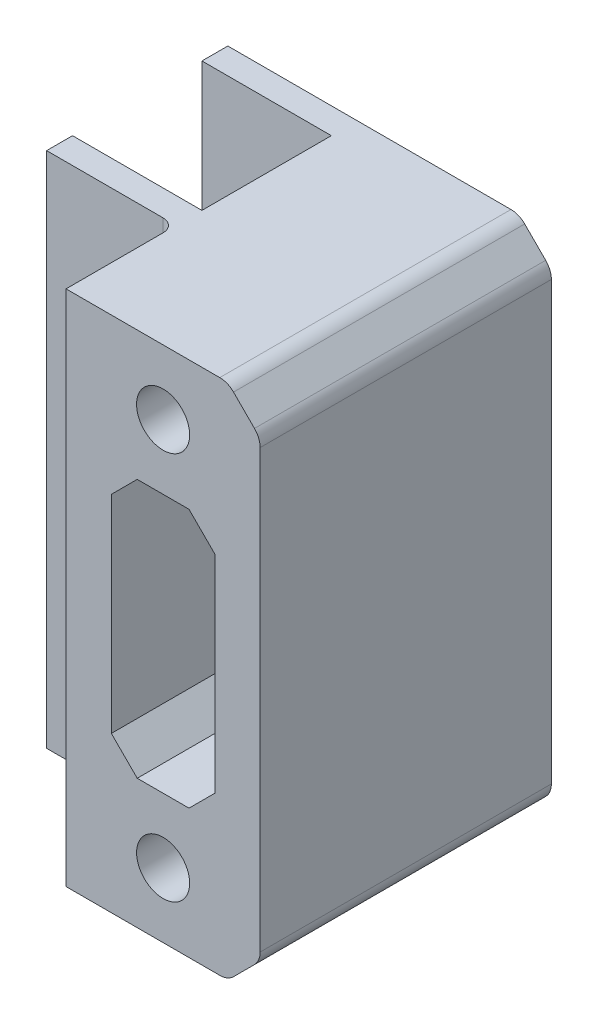
ISO-10303-21;
HEADER;
FILE_DESCRIPTION(('STEP AP214'),'2;1');
FILE_NAME('part.step','',(''),(''),'','','');
FILE_SCHEMA(('AUTOMOTIVE_DESIGN { 1 0 10303 214 1 1 1 1 }'));
ENDSEC;
DATA;
#1=APPLICATION_CONTEXT('core data for automotive mechanical design processes');
#2=APPLICATION_PROTOCOL_DEFINITION('international standard','automotive_design',2000,#1);
#3=PRODUCT_CONTEXT('',#1,'mechanical');
#4=PRODUCT('Part','Part','',(#3));
#5=PRODUCT_RELATED_PRODUCT_CATEGORY('part','',(#4));
#6=PRODUCT_DEFINITION_FORMATION('','',#4);
#7=PRODUCT_DEFINITION_CONTEXT('part definition',#1,'design');
#8=PRODUCT_DEFINITION('design','',#6,#7);
#9=PRODUCT_DEFINITION_SHAPE('','',#8);
#10=(LENGTH_UNIT() NAMED_UNIT(*) SI_UNIT(.MILLI.,.METRE.));
#11=(NAMED_UNIT(*) PLANE_ANGLE_UNIT() SI_UNIT($,.RADIAN.));
#12=(NAMED_UNIT(*) SI_UNIT($,.STERADIAN.) SOLID_ANGLE_UNIT());
#13=UNCERTAINTY_MEASURE_WITH_UNIT(LENGTH_MEASURE(1.E-05),#10,'distance_accuracy_value','');
#14=(GEOMETRIC_REPRESENTATION_CONTEXT(3) GLOBAL_UNCERTAINTY_ASSIGNED_CONTEXT((#13)) GLOBAL_UNIT_ASSIGNED_CONTEXT((#10,
#11,#12)) REPRESENTATION_CONTEXT('',''));
#15=CARTESIAN_POINT('',(0.,0.,0.));
#16=DIRECTION('',(0.,0.,1.));
#17=DIRECTION('',(1.,0.,0.));
#18=AXIS2_PLACEMENT_3D('',#15,#16,#17);
#19=CARTESIAN_POINT('',(0.,29.9999999999997,22.5));
#20=DIRECTION('',(0.,0.,-1.));
#21=DIRECTION('',(-1.,0.,0.));
#22=AXIS2_PLACEMENT_3D('',#19,#20,#21);
#23=CYLINDRICAL_SURFACE('',#22,4.10000000000005);
#24=CARTESIAN_POINT('',(0.,29.9999999999997,22.5));
#25=DIRECTION('',(0.,0.,1.));
#26=DIRECTION('',(1.,0.,0.));
#27=AXIS2_PLACEMENT_3D('',#24,#25,#26);
#28=CIRCLE('',#27,4.10000000000005);
#29=CARTESIAN_POINT('',(-4.10000000000005,29.9999999999997,22.5));
#30=VERTEX_POINT('',#29);
#31=EDGE_CURVE('E282',#30,#30,#28,.T.);
#32=CARTESIAN_POINT('',(0.,29.9999999999997,2.5));
#33=DIRECTION('',(0.,0.,-1.));
#34=DIRECTION('',(-1.,0.,0.));
#35=AXIS2_PLACEMENT_3D('',#32,#33,#34);
#36=CIRCLE('',#35,4.10000000000005);
#37=CARTESIAN_POINT('',(-4.10000000000005,29.9999999999997,2.50000000000001));
#38=VERTEX_POINT('',#37);
#39=EDGE_CURVE('E246',#38,#38,#36,.T.);
#40=CARTESIAN_POINT('',(-4.10000000000005,29.9999999999997,22.5));
#41=CARTESIAN_POINT('',(-4.10000000000005,29.9999999999997,22.2916666666667));
#42=CARTESIAN_POINT('',(-4.10000000000005,29.9999999999997,22.0833333333333));
#43=CARTESIAN_POINT('',(-4.10000000000005,29.9999999999997,21.6666666666667));
#44=CARTESIAN_POINT('',(-4.10000000000005,29.9999999999997,21.4583333333333));
#45=CARTESIAN_POINT('',(-4.10000000000005,29.9999999999997,21.0416666666667));
#46=CARTESIAN_POINT('',(-4.10000000000005,29.9999999999997,20.8333333333333));
#47=CARTESIAN_POINT('',(-4.10000000000005,29.9999999999997,20.4166666666667));
#48=CARTESIAN_POINT('',(-4.10000000000005,29.9999999999997,20.2083333333333));
#49=CARTESIAN_POINT('',(-4.10000000000005,29.9999999999997,19.7916666666667));
#50=CARTESIAN_POINT('',(-4.10000000000005,29.9999999999997,19.5833333333333));
#51=CARTESIAN_POINT('',(-4.10000000000005,29.9999999999997,19.1666666666667));
#52=CARTESIAN_POINT('',(-4.10000000000005,29.9999999999997,18.9583333333333));
#53=CARTESIAN_POINT('',(-4.10000000000005,29.9999999999997,18.5416666666667));
#54=CARTESIAN_POINT('',(-4.10000000000005,29.9999999999997,18.3333333333333));
#55=CARTESIAN_POINT('',(-4.10000000000005,29.9999999999997,17.9166666666667));
#56=CARTESIAN_POINT('',(-4.10000000000005,29.9999999999997,17.7083333333333));
#57=CARTESIAN_POINT('',(-4.10000000000005,29.9999999999997,17.2916666666667));
#58=CARTESIAN_POINT('',(-4.10000000000005,29.9999999999997,17.0833333333333));
#59=CARTESIAN_POINT('',(-4.10000000000005,29.9999999999997,16.6666666666667));
#60=CARTESIAN_POINT('',(-4.10000000000005,29.9999999999997,16.4583333333333));
#61=CARTESIAN_POINT('',(-4.10000000000005,29.9999999999997,16.0416666666667));
#62=CARTESIAN_POINT('',(-4.10000000000005,29.9999999999997,15.8333333333333));
#63=CARTESIAN_POINT('',(-4.10000000000005,29.9999999999997,15.4166666666667));
#64=CARTESIAN_POINT('',(-4.10000000000005,29.9999999999997,15.2083333333333));
#65=CARTESIAN_POINT('',(-4.10000000000005,29.9999999999997,14.7916666666667));
#66=CARTESIAN_POINT('',(-4.10000000000005,29.9999999999997,14.5833333333333));
#67=CARTESIAN_POINT('',(-4.10000000000005,29.9999999999997,14.1666666666667));
#68=CARTESIAN_POINT('',(-4.10000000000005,29.9999999999997,13.9583333333333));
#69=CARTESIAN_POINT('',(-4.10000000000005,29.9999999999997,13.5416666666667));
#70=CARTESIAN_POINT('',(-4.10000000000005,29.9999999999997,13.3333333333333));
#71=CARTESIAN_POINT('',(-4.10000000000005,29.9999999999997,12.9166666666667));
#72=CARTESIAN_POINT('',(-4.10000000000005,29.9999999999997,12.7083333333333));
#73=CARTESIAN_POINT('',(-4.10000000000005,29.9999999999997,12.2916666666667));
#74=CARTESIAN_POINT('',(-4.10000000000005,29.9999999999997,12.0833333333333));
#75=CARTESIAN_POINT('',(-4.10000000000005,29.9999999999997,11.6666666666667));
#76=CARTESIAN_POINT('',(-4.10000000000005,29.9999999999997,11.4583333333333));
#77=CARTESIAN_POINT('',(-4.10000000000005,29.9999999999997,11.0416666666667));
#78=CARTESIAN_POINT('',(-4.10000000000005,29.9999999999997,10.8333333333333));
#79=CARTESIAN_POINT('',(-4.10000000000005,29.9999999999997,10.4166666666667));
#80=CARTESIAN_POINT('',(-4.10000000000005,29.9999999999997,10.2083333333333));
#81=CARTESIAN_POINT('',(-4.10000000000005,29.9999999999997,9.79166666666667));
#82=CARTESIAN_POINT('',(-4.10000000000005,29.9999999999997,9.58333333333333));
#83=CARTESIAN_POINT('',(-4.10000000000005,29.9999999999997,9.16666666666667));
#84=CARTESIAN_POINT('',(-4.10000000000005,29.9999999999997,8.95833333333333));
#85=CARTESIAN_POINT('',(-4.10000000000005,29.9999999999997,8.54166666666667));
#86=CARTESIAN_POINT('',(-4.10000000000005,29.9999999999997,8.33333333333334));
#87=CARTESIAN_POINT('',(-4.10000000000005,29.9999999999997,7.91666666666667));
#88=CARTESIAN_POINT('',(-4.10000000000005,29.9999999999997,7.70833333333334));
#89=CARTESIAN_POINT('',(-4.10000000000005,29.9999999999997,7.29166666666667));
#90=CARTESIAN_POINT('',(-4.10000000000005,29.9999999999997,7.08333333333333));
#91=CARTESIAN_POINT('',(-4.10000000000005,29.9999999999997,6.66666666666667));
#92=CARTESIAN_POINT('',(-4.10000000000005,29.9999999999997,6.45833333333334));
#93=CARTESIAN_POINT('',(-4.10000000000005,29.9999999999997,6.04166666666667));
#94=CARTESIAN_POINT('',(-4.10000000000005,29.9999999999997,5.83333333333334));
#95=CARTESIAN_POINT('',(-4.10000000000005,29.9999999999997,5.41666666666667));
#96=CARTESIAN_POINT('',(-4.10000000000005,29.9999999999997,5.20833333333334));
#97=CARTESIAN_POINT('',(-4.10000000000005,29.9999999999997,4.79166666666667));
#98=CARTESIAN_POINT('',(-4.10000000000005,29.9999999999997,4.58333333333334));
#99=CARTESIAN_POINT('',(-4.10000000000005,29.9999999999997,4.16666666666667));
#100=CARTESIAN_POINT('',(-4.10000000000005,29.9999999999997,3.95833333333334));
#101=CARTESIAN_POINT('',(-4.10000000000005,29.9999999999997,3.54166666666667));
#102=CARTESIAN_POINT('',(-4.10000000000005,29.9999999999997,3.33333333333334));
#103=CARTESIAN_POINT('',(-4.10000000000005,29.9999999999997,2.91666666666667));
#104=CARTESIAN_POINT('',(-4.10000000000005,29.9999999999997,2.70833333333334));
#105=CARTESIAN_POINT('',(-4.10000000000005,29.9999999999997,2.50000000000001));
#106=B_SPLINE_CURVE_WITH_KNOTS('',3,(#40,#41,#42,#43,#44,#45,#46,#47,#48,#49,#50,#51,#52,#53,
#54,#55,#56,#57,#58,#59,#60,#61,#62,#63,#64,#65,#66,#67,#68,#69,#70,#71,#72,#73,#74,#75,#76,#77,
#78,#79,#80,#81,#82,#83,#84,#85,#86,#87,#88,#89,#90,#91,#92,#93,#94,#95,#96,#97,#98,#99,#100,
#101,#102,#103,#104,#105),.UNSPECIFIED.,.F.,.F.,(4,2,2,2,2,2,2,2,2,2,2,2,2,2,2,2,2,2,2,2,2,2,2,
2,2,2,2,2,2,2,2,2,4),(0.,0.625000000000001,1.25,1.875,2.5,3.125,3.75,4.375,5.,5.625,6.25,6.875,
7.5,8.125,8.75,9.375,10.,10.625,11.25,11.875,12.5,13.125,13.75,14.375,15.,15.625,16.25,16.875,
17.5,18.125,18.75,19.375,20.),.UNSPECIFIED.);
#107=EDGE_CURVE('BSEAM44',#30,#38,#106,.T.);
#108=ORIENTED_EDGE('',*,*,#31,.T.);
#109=ORIENTED_EDGE('',*,*,#39,.T.);
#110=ORIENTED_EDGE('',*,*,#107,.T.);
#111=ORIENTED_EDGE('',*,*,#107,.F.);
#112=EDGE_LOOP('',(#108,#110,#109,#111));
#113=FACE_BOUND('',#112,.T.);
#114=ADVANCED_FACE('F44',(#113),#23,.F.);
#115=CARTESIAN_POINT('',(0.,-30.,22.5));
#116=DIRECTION('',(0.,0.,-1.));
#117=DIRECTION('',(-1.,0.,0.));
#118=AXIS2_PLACEMENT_3D('',#115,#116,#117);
#119=CYLINDRICAL_SURFACE('',#118,4.1);
#120=CARTESIAN_POINT('',(0.,-30.,22.5));
#121=DIRECTION('',(0.,0.,1.));
#122=DIRECTION('',(1.,0.,0.));
#123=AXIS2_PLACEMENT_3D('',#120,#121,#122);
#124=CIRCLE('',#123,4.1);
#125=CARTESIAN_POINT('',(-4.1,-30.,22.5));
#126=VERTEX_POINT('',#125);
#127=EDGE_CURVE('E254',#126,#126,#124,.T.);
#128=CARTESIAN_POINT('',(0.,-30.,2.5));
#129=DIRECTION('',(0.,0.,-1.));
#130=DIRECTION('',(-1.,0.,0.));
#131=AXIS2_PLACEMENT_3D('',#128,#129,#130);
#132=CIRCLE('',#131,4.1);
#133=CARTESIAN_POINT('',(-4.1,-30.,2.50000000000001));
#134=VERTEX_POINT('',#133);
#135=EDGE_CURVE('E264',#134,#134,#132,.T.);
#136=CARTESIAN_POINT('',(-4.1,-30.,22.5));
#137=CARTESIAN_POINT('',(-4.1,-30.,22.2916666666667));
#138=CARTESIAN_POINT('',(-4.1,-30.,22.0833333333333));
#139=CARTESIAN_POINT('',(-4.1,-30.,21.6666666666667));
#140=CARTESIAN_POINT('',(-4.1,-30.,21.4583333333333));
#141=CARTESIAN_POINT('',(-4.1,-30.,21.0416666666667));
#142=CARTESIAN_POINT('',(-4.1,-30.,20.8333333333333));
#143=CARTESIAN_POINT('',(-4.1,-30.,20.4166666666667));
#144=CARTESIAN_POINT('',(-4.1,-30.,20.2083333333333));
#145=CARTESIAN_POINT('',(-4.1,-30.,19.7916666666667));
#146=CARTESIAN_POINT('',(-4.1,-30.,19.5833333333333));
#147=CARTESIAN_POINT('',(-4.1,-30.,19.1666666666667));
#148=CARTESIAN_POINT('',(-4.1,-30.,18.9583333333333));
#149=CARTESIAN_POINT('',(-4.1,-30.,18.5416666666667));
#150=CARTESIAN_POINT('',(-4.1,-30.,18.3333333333333));
#151=CARTESIAN_POINT('',(-4.1,-30.,17.9166666666667));
#152=CARTESIAN_POINT('',(-4.1,-30.,17.7083333333333));
#153=CARTESIAN_POINT('',(-4.1,-30.,17.2916666666667));
#154=CARTESIAN_POINT('',(-4.1,-30.,17.0833333333333));
#155=CARTESIAN_POINT('',(-4.1,-30.,16.6666666666667));
#156=CARTESIAN_POINT('',(-4.1,-30.,16.4583333333333));
#157=CARTESIAN_POINT('',(-4.1,-30.,16.0416666666667));
#158=CARTESIAN_POINT('',(-4.1,-30.,15.8333333333333));
#159=CARTESIAN_POINT('',(-4.1,-30.,15.4166666666667));
#160=CARTESIAN_POINT('',(-4.1,-30.,15.2083333333333));
#161=CARTESIAN_POINT('',(-4.1,-30.,14.7916666666667));
#162=CARTESIAN_POINT('',(-4.1,-30.,14.5833333333333));
#163=CARTESIAN_POINT('',(-4.1,-30.,14.1666666666667));
#164=CARTESIAN_POINT('',(-4.1,-30.,13.9583333333333));
#165=CARTESIAN_POINT('',(-4.1,-30.,13.5416666666667));
#166=CARTESIAN_POINT('',(-4.1,-30.,13.3333333333333));
#167=CARTESIAN_POINT('',(-4.1,-30.,12.9166666666667));
#168=CARTESIAN_POINT('',(-4.1,-30.,12.7083333333333));
#169=CARTESIAN_POINT('',(-4.1,-30.,12.2916666666667));
#170=CARTESIAN_POINT('',(-4.1,-30.,12.0833333333333));
#171=CARTESIAN_POINT('',(-4.1,-30.,11.6666666666667));
#172=CARTESIAN_POINT('',(-4.1,-30.,11.4583333333333));
#173=CARTESIAN_POINT('',(-4.1,-30.,11.0416666666667));
#174=CARTESIAN_POINT('',(-4.1,-30.,10.8333333333333));
#175=CARTESIAN_POINT('',(-4.1,-30.,10.4166666666667));
#176=CARTESIAN_POINT('',(-4.1,-30.,10.2083333333333));
#177=CARTESIAN_POINT('',(-4.1,-30.,9.79166666666667));
#178=CARTESIAN_POINT('',(-4.1,-30.,9.58333333333333));
#179=CARTESIAN_POINT('',(-4.1,-30.,9.16666666666667));
#180=CARTESIAN_POINT('',(-4.1,-30.,8.95833333333333));
#181=CARTESIAN_POINT('',(-4.1,-30.,8.54166666666667));
#182=CARTESIAN_POINT('',(-4.1,-30.,8.33333333333334));
#183=CARTESIAN_POINT('',(-4.1,-30.,7.91666666666667));
#184=CARTESIAN_POINT('',(-4.1,-30.,7.70833333333334));
#185=CARTESIAN_POINT('',(-4.1,-30.,7.29166666666667));
#186=CARTESIAN_POINT('',(-4.1,-30.,7.08333333333333));
#187=CARTESIAN_POINT('',(-4.1,-30.,6.66666666666667));
#188=CARTESIAN_POINT('',(-4.1,-30.,6.45833333333334));
#189=CARTESIAN_POINT('',(-4.1,-30.,6.04166666666667));
#190=CARTESIAN_POINT('',(-4.1,-30.,5.83333333333334));
#191=CARTESIAN_POINT('',(-4.1,-30.,5.41666666666667));
#192=CARTESIAN_POINT('',(-4.1,-30.,5.20833333333334));
#193=CARTESIAN_POINT('',(-4.1,-30.,4.79166666666667));
#194=CARTESIAN_POINT('',(-4.1,-30.,4.58333333333334));
#195=CARTESIAN_POINT('',(-4.1,-30.,4.16666666666667));
#196=CARTESIAN_POINT('',(-4.1,-30.,3.95833333333334));
#197=CARTESIAN_POINT('',(-4.1,-30.,3.54166666666667));
#198=CARTESIAN_POINT('',(-4.1,-30.,3.33333333333334));
#199=CARTESIAN_POINT('',(-4.1,-30.,2.91666666666667));
#200=CARTESIAN_POINT('',(-4.1,-30.,2.70833333333334));
#201=CARTESIAN_POINT('',(-4.1,-30.,2.50000000000001));
#202=B_SPLINE_CURVE_WITH_KNOTS('',3,(#136,#137,#138,#139,#140,#141,#142,#143,#144,#145,#146,
#147,#148,#149,#150,#151,#152,#153,#154,#155,#156,#157,#158,#159,#160,#161,#162,#163,#164,#165,
#166,#167,#168,#169,#170,#171,#172,#173,#174,#175,#176,#177,#178,#179,#180,#181,#182,#183,#184,
#185,#186,#187,#188,#189,#190,#191,#192,#193,#194,#195,#196,#197,#198,#199,#200,#201),
.UNSPECIFIED.,.F.,.F.,(4,2,2,2,2,2,2,2,2,2,2,2,2,2,2,2,2,2,2,2,2,2,2,2,2,2,2,2,2,2,2,2,4),(0.,
0.625000000000001,1.25,1.875,2.5,3.125,3.75,4.375,5.,5.625,6.25,6.875,7.5,8.125,8.75,9.375,10.,
10.625,11.25,11.875,12.5,13.125,13.75,14.375,15.,15.625,16.25,16.875,17.5,18.125,18.75,19.375,
20.),.UNSPECIFIED.);
#203=EDGE_CURVE('BSEAM440',#126,#134,#202,.T.);
#204=ORIENTED_EDGE('',*,*,#127,.T.);
#205=ORIENTED_EDGE('',*,*,#135,.T.);
#206=ORIENTED_EDGE('',*,*,#203,.T.);
#207=ORIENTED_EDGE('',*,*,#203,.F.);
#208=EDGE_LOOP('',(#204,#206,#205,#207));
#209=FACE_BOUND('',#208,.T.);
#210=ADVANCED_FACE('F440',(#209),#119,.F.);
#211=CARTESIAN_POINT('',(-14.9999999998273,40.,22.5));
#212=DIRECTION('',(1.,0.,0.));
#213=DIRECTION('',(0.,1.,0.));
#214=AXIS2_PLACEMENT_3D('',#211,#212,#213);
#215=PLANE('',#214);
#216=DIRECTION('',(0.,1.,0.));
#217=VECTOR('',#216,1.);
#218=CARTESIAN_POINT('',(-14.9999999998273,-40.,-18.5));
#219=LINE('',#218,#217);
#220=CARTESIAN_POINT('',(-14.9999999998272,-40.,-18.5));
#221=VERTEX_POINT('',#220);
#222=CARTESIAN_POINT('',(-14.9999999998273,40.,-18.5));
#223=VERTEX_POINT('',#222);
#224=EDGE_CURVE('E251',#221,#223,#219,.T.);
#225=ORIENTED_EDGE('',*,*,#224,.F.);
#226=DIRECTION('',(0.,0.,-1.));
#227=VECTOR('',#226,1.);
#228=CARTESIAN_POINT('',(-14.9999999998272,-40.,22.5));
#229=LINE('',#228,#227);
#230=CARTESIAN_POINT('',(-14.9999999998273,-40.,1.49999999999999));
#231=VERTEX_POINT('',#230);
#232=EDGE_CURVE('E394',#231,#221,#229,.T.);
#233=ORIENTED_EDGE('',*,*,#232,.F.);
#234=DIRECTION('',(0.,1.,0.));
#235=VECTOR('',#234,1.);
#236=CARTESIAN_POINT('',(-14.9999999998273,-40.,1.49999999999999));
#237=LINE('',#236,#235);
#238=CARTESIAN_POINT('',(-14.9999999998273,40.,1.5));
#239=VERTEX_POINT('',#238);
#240=EDGE_CURVE('E256',#231,#239,#237,.T.);
#241=ORIENTED_EDGE('',*,*,#240,.T.);
#242=DIRECTION('',(0.,0.,-1.));
#243=VECTOR('',#242,1.);
#244=CARTESIAN_POINT('',(-14.9999999998273,40.,22.5));
#245=LINE('',#244,#243);
#246=EDGE_CURVE('E397',#239,#223,#245,.T.);
#247=ORIENTED_EDGE('',*,*,#246,.T.);
#248=EDGE_LOOP('',(#225,#233,#241,#247));
#249=FACE_BOUND('',#248,.T.);
#250=ADVANCED_FACE('F446',(#249),#215,.F.);
#251=CARTESIAN_POINT('',(-14.9999999998273,40.,22.5));
#252=VERTEX_POINT('',#251);
#253=CARTESIAN_POINT('',(-14.9999999998273,40.,7.5));
#254=VERTEX_POINT('',#253);
#255=EDGE_CURVE('E398',#252,#254,#245,.T.);
#256=ORIENTED_EDGE('',*,*,#255,.T.);
#257=DIRECTION('',(0.,1.,0.));
#258=VECTOR('',#257,1.);
#259=CARTESIAN_POINT('',(-14.9999999998273,40.,7.49999999999999));
#260=LINE('',#259,#258);
#261=CARTESIAN_POINT('',(-14.9999999998272,-40.,7.5));
#262=VERTEX_POINT('',#261);
#263=EDGE_CURVE('E65',#254,#262,#260,.F.);
#264=ORIENTED_EDGE('',*,*,#263,.T.);
#265=CARTESIAN_POINT('',(-14.9999999998272,-40.,22.5));
#266=VERTEX_POINT('',#265);
#267=EDGE_CURVE('E395',#266,#262,#229,.T.);
#268=ORIENTED_EDGE('',*,*,#267,.F.);
#269=DIRECTION('',(0.,-1.,0.));
#270=VECTOR('',#269,1.);
#271=CARTESIAN_POINT('',(-14.9999999998273,40.,22.5));
#272=LINE('',#271,#270);
#273=EDGE_CURVE('E355',#252,#266,#272,.T.);
#274=ORIENTED_EDGE('',*,*,#273,.F.);
#275=EDGE_LOOP('',(#256,#264,#268,#274));
#276=FACE_BOUND('',#275,.T.);
#277=ADVANCED_FACE('F488',(#276),#215,.F.);
#278=CARTESIAN_POINT('',(11.9999999998274,33.7573593128786,22.5));
#279=DIRECTION('',(0.,0.,1.));
#280=DIRECTION('',(1.,0.,0.));
#281=AXIS2_PLACEMENT_3D('',#278,#279,#280);
#282=PLANE('',#281);
#283=ORIENTED_EDGE('',*,*,#31,.F.);
#284=EDGE_LOOP('',(#283));
#285=FACE_BOUND('',#284,.T.);
#286=CARTESIAN_POINT('',(11.9999999998274,33.7573593128786,22.5));
#287=DIRECTION('',(0.,0.,1.));
#288=DIRECTION('',(1.,0.,0.));
#289=AXIS2_PLACEMENT_3D('',#286,#287,#288);
#290=CIRCLE('',#289,2.99999999999985);
#291=CARTESIAN_POINT('',(14.9999999998272,33.7573593128786,22.5));
#292=VERTEX_POINT('',#291);
#293=CARTESIAN_POINT('',(14.1213203433873,35.8786796564377,22.5));
#294=VERTEX_POINT('',#293);
#295=EDGE_CURVE('E345',#292,#294,#290,.T.);
#296=ORIENTED_EDGE('',*,*,#295,.T.);
#297=DIRECTION('',(-0.707106781186395,0.707106781186701,0.));
#298=VECTOR('',#297,1.);
#299=CARTESIAN_POINT('',(14.1213203433873,35.8786796564377,22.5));
#300=LINE('',#299,#298);
#301=CARTESIAN_POINT('',(10.8786796562673,39.1213203435592,22.5));
#302=VERTEX_POINT('',#301);
#303=EDGE_CURVE('E348',#294,#302,#300,.T.);
#304=ORIENTED_EDGE('',*,*,#303,.T.);
#305=CARTESIAN_POINT('',(8.75735931270718,37.,22.5));
#306=DIRECTION('',(0.,0.,1.));
#307=DIRECTION('',(1.,0.,0.));
#308=AXIS2_PLACEMENT_3D('',#305,#306,#307);
#309=CIRCLE('',#308,3.);
#310=CARTESIAN_POINT('',(8.75735931270718,40.,22.5));
#311=VERTEX_POINT('',#310);
#312=EDGE_CURVE('E351',#302,#311,#309,.T.);
#313=ORIENTED_EDGE('',*,*,#312,.T.);
#314=DIRECTION('',(-1.,0.,0.));
#315=VECTOR('',#314,1.);
#316=CARTESIAN_POINT('',(8.75735931270718,40.,22.5));
#317=LINE('',#316,#315);
#318=EDGE_CURVE('E353',#311,#252,#317,.T.);
#319=ORIENTED_EDGE('',*,*,#318,.T.);
#320=ORIENTED_EDGE('',*,*,#273,.T.);
#321=DIRECTION('',(1.,0.,0.));
#322=VECTOR('',#321,1.);
#323=CARTESIAN_POINT('',(-14.9999999998272,-40.,22.5));
#324=LINE('',#323,#322);
#325=CARTESIAN_POINT('',(8.75735931270794,-40.,22.5));
#326=VERTEX_POINT('',#325);
#327=EDGE_CURVE('E357',#266,#326,#324,.T.);
#328=ORIENTED_EDGE('',*,*,#327,.T.);
#329=CARTESIAN_POINT('',(8.75735931270718,-37.0000000000005,22.5));
#330=DIRECTION('',(0.,0.,1.));
#331=DIRECTION('',(1.,0.,0.));
#332=AXIS2_PLACEMENT_3D('',#329,#330,#331);
#333=CIRCLE('',#332,2.99999999999946);
#334=CARTESIAN_POINT('',(10.8786796562673,-39.121320343559,22.5));
#335=VERTEX_POINT('',#334);
#336=EDGE_CURVE('E359',#326,#335,#333,.T.);
#337=ORIENTED_EDGE('',*,*,#336,.T.);
#338=DIRECTION('',(0.707106781186592,0.707106781186502,0.));
#339=VECTOR('',#338,1.);
#340=CARTESIAN_POINT('',(10.8786796562673,-39.121320343559,22.5));
#341=LINE('',#340,#339);
#342=CARTESIAN_POINT('',(14.1213203433873,-35.8786796564393,22.5));
#343=VERTEX_POINT('',#342);
#344=EDGE_CURVE('E361',#335,#343,#341,.T.);
#345=ORIENTED_EDGE('',*,*,#344,.T.);
#346=CARTESIAN_POINT('',(11.9999999998273,-33.7573593128808,22.5));
#347=DIRECTION('',(0.,0.,1.));
#348=DIRECTION('',(1.,0.,0.));
#349=AXIS2_PLACEMENT_3D('',#346,#347,#348);
#350=CIRCLE('',#349,2.99999999999968);
#351=CARTESIAN_POINT('',(14.999999999827,-33.7573593128808,22.5));
#352=VERTEX_POINT('',#351);
#353=EDGE_CURVE('E363',#343,#352,#350,.T.);
#354=ORIENTED_EDGE('',*,*,#353,.T.);
#355=DIRECTION('',(0.,1.,0.));
#356=VECTOR('',#355,1.);
#357=CARTESIAN_POINT('',(14.9999999998272,-33.7573593128808,22.5));
#358=LINE('',#357,#356);
#359=EDGE_CURVE('E365',#352,#292,#358,.T.);
#360=ORIENTED_EDGE('',*,*,#359,.T.);
#361=EDGE_LOOP('',(#296,#304,#313,#319,#320,#328,#337,#345,#354,#360));
#362=FACE_BOUND('',#361,.T.);
#363=DIRECTION('',(0.707106781186568,0.707106781186527,0.));
#364=VECTOR('',#363,1.);
#365=CARTESIAN_POINT('',(8.,-16.,22.5));
#366=LINE('',#365,#364);
#367=CARTESIAN_POINT('',(3.99999999999983,-20.,22.5));
#368=VERTEX_POINT('',#367);
#369=CARTESIAN_POINT('',(8.,-16.,22.5));
#370=VERTEX_POINT('',#369);
#371=EDGE_CURVE('E288',#368,#370,#366,.T.);
#372=ORIENTED_EDGE('',*,*,#371,.F.);
#373=DIRECTION('',(1.,0.,0.));
#374=VECTOR('',#373,1.);
#375=CARTESIAN_POINT('',(-4.00000000000017,-20.,22.5));
#376=LINE('',#375,#374);
#377=CARTESIAN_POINT('',(-4.00000000000017,-20.,22.5));
#378=VERTEX_POINT('',#377);
#379=EDGE_CURVE('E286',#378,#368,#376,.T.);
#380=ORIENTED_EDGE('',*,*,#379,.F.);
#381=DIRECTION('',(0.707106781186536,-0.707106781186559,0.));
#382=VECTOR('',#381,1.);
#383=CARTESIAN_POINT('',(-4.00000000000017,-20.,22.5));
#384=LINE('',#383,#382);
#385=CARTESIAN_POINT('',(-7.99999999999999,-16.,22.5));
#386=VERTEX_POINT('',#385);
#387=EDGE_CURVE('E302',#386,#378,#384,.T.);
#388=ORIENTED_EDGE('',*,*,#387,.F.);
#389=DIRECTION('',(0.,-1.,0.));
#390=VECTOR('',#389,1.);
#391=CARTESIAN_POINT('',(-7.99999999999999,16.,22.5));
#392=LINE('',#391,#390);
#393=CARTESIAN_POINT('',(-7.99999999999999,16.,22.5));
#394=VERTEX_POINT('',#393);
#395=EDGE_CURVE('E299',#394,#386,#392,.T.);
#396=ORIENTED_EDGE('',*,*,#395,.F.);
#397=DIRECTION('',(-0.707106781186547,-0.707106781186548,0.));
#398=VECTOR('',#397,1.);
#399=CARTESIAN_POINT('',(-7.99999999999999,16.,22.5));
#400=LINE('',#399,#398);
#401=CARTESIAN_POINT('',(-4.00000000000017,19.9999999999998,22.5));
#402=VERTEX_POINT('',#401);
#403=EDGE_CURVE('E297',#402,#394,#400,.T.);
#404=ORIENTED_EDGE('',*,*,#403,.F.);
#405=DIRECTION('',(-1.,0.,0.));
#406=VECTOR('',#405,1.);
#407=CARTESIAN_POINT('',(3.99999999999983,20.,22.5));
#408=LINE('',#407,#406);
#409=CARTESIAN_POINT('',(3.99999999999983,20.,22.5));
#410=VERTEX_POINT('',#409);
#411=EDGE_CURVE('E295',#410,#402,#408,.T.);
#412=ORIENTED_EDGE('',*,*,#411,.F.);
#413=DIRECTION('',(-0.707106781186562,0.707106781186533,0.));
#414=VECTOR('',#413,1.);
#415=CARTESIAN_POINT('',(3.99999999999983,20.,22.5));
#416=LINE('',#415,#414);
#417=CARTESIAN_POINT('',(8.00000000000001,16.,22.5));
#418=VERTEX_POINT('',#417);
#419=EDGE_CURVE('E293',#418,#410,#416,.T.);
#420=ORIENTED_EDGE('',*,*,#419,.F.);
#421=DIRECTION('',(0.,1.,0.));
#422=VECTOR('',#421,1.);
#423=CARTESIAN_POINT('',(8.,-16.,22.5));
#424=LINE('',#423,#422);
#425=EDGE_CURVE('E291',#370,#418,#424,.T.);
#426=ORIENTED_EDGE('',*,*,#425,.F.);
#427=EDGE_LOOP('',(#372,#380,#388,#396,#404,#412,#420,#426));
#428=FACE_BOUND('',#427,.T.);
#429=ORIENTED_EDGE('',*,*,#127,.F.);
#430=EDGE_LOOP('',(#429));
#431=FACE_BOUND('',#430,.T.);
#432=ADVANCED_FACE('F485',(#285,#362,#428,#431),#282,.T.);
#433=CARTESIAN_POINT('',(11.9999999998274,33.7573593128786,-22.5));
#434=DIRECTION('',(0.,0.,1.));
#435=DIRECTION('',(1.,0.,0.));
#436=AXIS2_PLACEMENT_3D('',#433,#434,#435);
#437=PLANE('',#436);
#438=CARTESIAN_POINT('',(11.9999999998274,33.7573593128786,-22.5));
#439=DIRECTION('',(0.,0.,1.));
#440=DIRECTION('',(1.,0.,0.));
#441=AXIS2_PLACEMENT_3D('',#438,#439,#440);
#442=CIRCLE('',#441,2.99999999999985);
#443=CARTESIAN_POINT('',(14.9999999998272,33.7573593128786,-22.5));
#444=VERTEX_POINT('',#443);
#445=CARTESIAN_POINT('',(14.1213203433873,35.8786796564377,-22.5));
#446=VERTEX_POINT('',#445);
#447=EDGE_CURVE('E344',#444,#446,#442,.T.);
#448=ORIENTED_EDGE('',*,*,#447,.F.);
#449=DIRECTION('',(0.,1.,0.));
#450=VECTOR('',#449,1.);
#451=CARTESIAN_POINT('',(14.9999999998272,-33.7573593128808,-22.5));
#452=LINE('',#451,#450);
#453=CARTESIAN_POINT('',(14.999999999827,-33.7573593128808,-22.5));
#454=VERTEX_POINT('',#453);
#455=EDGE_CURVE('E349',#454,#444,#452,.T.);
#456=ORIENTED_EDGE('',*,*,#455,.F.);
#457=CARTESIAN_POINT('',(11.9999999998273,-33.7573593128808,-22.5));
#458=DIRECTION('',(0.,0.,1.));
#459=DIRECTION('',(1.,0.,0.));
#460=AXIS2_PLACEMENT_3D('',#457,#458,#459);
#461=CIRCLE('',#460,2.99999999999968);
#462=CARTESIAN_POINT('',(14.1213203433873,-35.8786796564393,-22.5));
#463=VERTEX_POINT('',#462);
#464=EDGE_CURVE('E378',#463,#454,#461,.T.);
#465=ORIENTED_EDGE('',*,*,#464,.F.);
#466=DIRECTION('',(0.707106781186592,0.707106781186502,0.));
#467=VECTOR('',#466,1.);
#468=CARTESIAN_POINT('',(10.8786796562673,-39.121320343559,-22.5));
#469=LINE('',#468,#467);
#470=CARTESIAN_POINT('',(10.8786796562673,-39.121320343559,-22.5));
#471=VERTEX_POINT('',#470);
#472=EDGE_CURVE('E376',#471,#463,#469,.T.);
#473=ORIENTED_EDGE('',*,*,#472,.F.);
#474=CARTESIAN_POINT('',(8.75735931270718,-37.0000000000005,-22.5));
#475=DIRECTION('',(0.,0.,1.));
#476=DIRECTION('',(1.,0.,0.));
#477=AXIS2_PLACEMENT_3D('',#474,#475,#476);
#478=CIRCLE('',#477,2.99999999999946);
#479=CARTESIAN_POINT('',(8.75735931270794,-40.,-22.5));
#480=VERTEX_POINT('',#479);
#481=EDGE_CURVE('E220',#480,#471,#478,.T.);
#482=ORIENTED_EDGE('',*,*,#481,.F.);
#483=DIRECTION('',(1.,0.,0.));
#484=VECTOR('',#483,1.);
#485=CARTESIAN_POINT('',(-14.9999999998272,-40.,-22.5));
#486=LINE('',#485,#484);
#487=CARTESIAN_POINT('',(-34.9999999998273,-40.,-22.5));
#488=VERTEX_POINT('',#487);
#489=EDGE_CURVE('E211',#488,#480,#486,.T.);
#490=ORIENTED_EDGE('',*,*,#489,.F.);
#491=DIRECTION('',(0.,1.,0.));
#492=VECTOR('',#491,1.);
#493=CARTESIAN_POINT('',(-34.9999999998273,-40.,-22.5));
#494=LINE('',#493,#492);
#495=CARTESIAN_POINT('',(-34.9999999998273,40.,-22.5));
#496=VERTEX_POINT('',#495);
#497=EDGE_CURVE('E217',#488,#496,#494,.T.);
#498=ORIENTED_EDGE('',*,*,#497,.T.);
#499=DIRECTION('',(-1.,0.,0.));
#500=VECTOR('',#499,1.);
#501=CARTESIAN_POINT('',(8.75735931270718,40.,-22.5));
#502=LINE('',#501,#500);
#503=CARTESIAN_POINT('',(8.75735931270718,40.,-22.5));
#504=VERTEX_POINT('',#503);
#505=EDGE_CURVE('E225',#504,#496,#502,.T.);
#506=ORIENTED_EDGE('',*,*,#505,.F.);
#507=CARTESIAN_POINT('',(8.75735931270718,37.,-22.5));
#508=DIRECTION('',(0.,0.,1.));
#509=DIRECTION('',(1.,0.,0.));
#510=AXIS2_PLACEMENT_3D('',#507,#508,#509);
#511=CIRCLE('',#510,3.);
#512=CARTESIAN_POINT('',(10.8786796562673,39.1213203435592,-22.5));
#513=VERTEX_POINT('',#512);
#514=EDGE_CURVE('E372',#513,#504,#511,.T.);
#515=ORIENTED_EDGE('',*,*,#514,.F.);
#516=DIRECTION('',(-0.707106781186395,0.707106781186701,0.));
#517=VECTOR('',#516,1.);
#518=CARTESIAN_POINT('',(14.1213203433873,35.8786796564377,-22.5));
#519=LINE('',#518,#517);
#520=EDGE_CURVE('E370',#446,#513,#519,.T.);
#521=ORIENTED_EDGE('',*,*,#520,.F.);
#522=EDGE_LOOP('',(#448,#456,#465,#473,#482,#490,#498,#506,#515,#521));
#523=FACE_BOUND('',#522,.T.);
#524=DIRECTION('',(1.,0.,0.));
#525=VECTOR('',#524,1.);
#526=CARTESIAN_POINT('',(-4.00000000000017,-20.,-22.5));
#527=LINE('',#526,#525);
#528=CARTESIAN_POINT('',(-4.00000000000018,-20.,-22.5));
#529=VERTEX_POINT('',#528);
#530=CARTESIAN_POINT('',(3.99999999999983,-20.,-22.5));
#531=VERTEX_POINT('',#530);
#532=EDGE_CURVE('E285',#529,#531,#527,.T.);
#533=ORIENTED_EDGE('',*,*,#532,.T.);
#534=DIRECTION('',(0.707106781186568,0.707106781186527,0.));
#535=VECTOR('',#534,1.);
#536=CARTESIAN_POINT('',(8.,-16.,-22.5));
#537=LINE('',#536,#535);
#538=CARTESIAN_POINT('',(8.,-16.,-22.5));
#539=VERTEX_POINT('',#538);
#540=EDGE_CURVE('E307',#531,#539,#537,.T.);
#541=ORIENTED_EDGE('',*,*,#540,.T.);
#542=DIRECTION('',(0.,1.,0.));
#543=VECTOR('',#542,1.);
#544=CARTESIAN_POINT('',(8.,-16.,-22.5));
#545=LINE('',#544,#543);
#546=CARTESIAN_POINT('',(8.00000000000001,16.,-22.5));
#547=VERTEX_POINT('',#546);
#548=EDGE_CURVE('E310',#539,#547,#545,.T.);
#549=ORIENTED_EDGE('',*,*,#548,.T.);
#550=DIRECTION('',(-0.707106781186562,0.707106781186533,0.));
#551=VECTOR('',#550,1.);
#552=CARTESIAN_POINT('',(3.99999999999983,20.,-22.5));
#553=LINE('',#552,#551);
#554=CARTESIAN_POINT('',(3.99999999999983,20.,-22.5));
#555=VERTEX_POINT('',#554);
#556=EDGE_CURVE('E313',#547,#555,#553,.T.);
#557=ORIENTED_EDGE('',*,*,#556,.T.);
#558=DIRECTION('',(-1.,0.,0.));
#559=VECTOR('',#558,1.);
#560=CARTESIAN_POINT('',(3.99999999999983,20.,-22.5));
#561=LINE('',#560,#559);
#562=CARTESIAN_POINT('',(-4.00000000000017,19.9999999999998,-22.5));
#563=VERTEX_POINT('',#562);
#564=EDGE_CURVE('E316',#555,#563,#561,.T.);
#565=ORIENTED_EDGE('',*,*,#564,.T.);
#566=DIRECTION('',(-0.707106781186547,-0.707106781186548,0.));
#567=VECTOR('',#566,1.);
#568=CARTESIAN_POINT('',(-7.99999999999999,16.,-22.5));
#569=LINE('',#568,#567);
#570=CARTESIAN_POINT('',(-7.99999999999999,16.,-22.5));
#571=VERTEX_POINT('',#570);
#572=EDGE_CURVE('E319',#563,#571,#569,.T.);
#573=ORIENTED_EDGE('',*,*,#572,.T.);
#574=DIRECTION('',(0.,-1.,0.));
#575=VECTOR('',#574,1.);
#576=CARTESIAN_POINT('',(-7.99999999999999,16.,-22.5));
#577=LINE('',#576,#575);
#578=CARTESIAN_POINT('',(-7.99999999999999,-16.,-22.5));
#579=VERTEX_POINT('',#578);
#580=EDGE_CURVE('E322',#571,#579,#577,.T.);
#581=ORIENTED_EDGE('',*,*,#580,.T.);
#582=DIRECTION('',(0.707106781186536,-0.707106781186559,0.));
#583=VECTOR('',#582,1.);
#584=CARTESIAN_POINT('',(-4.00000000000017,-20.,-22.5));
#585=LINE('',#584,#583);
#586=EDGE_CURVE('E289',#579,#529,#585,.T.);
#587=ORIENTED_EDGE('',*,*,#586,.T.);
#588=EDGE_LOOP('',(#533,#541,#549,#557,#565,#573,#581,#587));
#589=FACE_BOUND('',#588,.T.);
#590=ADVANCED_FACE('F214',(#523,#589),#437,.F.);
#591=CARTESIAN_POINT('',(11.9999999998274,33.7573593128786,22.5));
#592=DIRECTION('',(0.,0.,-1.));
#593=DIRECTION('',(-1.,0.,0.));
#594=AXIS2_PLACEMENT_3D('',#591,#592,#593);
#595=CYLINDRICAL_SURFACE('',#594,2.99999999999985);
#596=ORIENTED_EDGE('',*,*,#447,.T.);
#597=DIRECTION('',(0.,0.,-1.));
#598=VECTOR('',#597,1.);
#599=CARTESIAN_POINT('',(14.1213203433873,35.8786796564377,22.5));
#600=LINE('',#599,#598);
#601=EDGE_CURVE('E406',#294,#446,#600,.T.);
#602=ORIENTED_EDGE('',*,*,#601,.F.);
#603=ORIENTED_EDGE('',*,*,#295,.F.);
#604=DIRECTION('',(0.,0.,-1.));
#605=VECTOR('',#604,1.);
#606=CARTESIAN_POINT('',(14.9999999998272,33.7573593128786,22.5));
#607=LINE('',#606,#605);
#608=EDGE_CURVE('E367',#292,#444,#607,.T.);
#609=ORIENTED_EDGE('',*,*,#608,.T.);
#610=EDGE_LOOP('',(#596,#602,#603,#609));
#611=FACE_BOUND('',#610,.T.);
#612=ADVANCED_FACE('F492',(#611),#595,.T.);
#613=CARTESIAN_POINT('',(14.1213203433873,35.8786796564377,22.5));
#614=DIRECTION('',(-0.7071067811867,-0.707106781186394,0.));
#615=DIRECTION('',(0.707106781186394,-0.707106781186701,0.));
#616=AXIS2_PLACEMENT_3D('',#613,#614,#615);
#617=PLANE('',#616);
#618=ORIENTED_EDGE('',*,*,#520,.T.);
#619=DIRECTION('',(0.,0.,-1.));
#620=VECTOR('',#619,1.);
#621=CARTESIAN_POINT('',(10.8786796562673,39.1213203435592,22.5));
#622=LINE('',#621,#620);
#623=EDGE_CURVE('E403',#302,#513,#622,.T.);
#624=ORIENTED_EDGE('',*,*,#623,.F.);
#625=ORIENTED_EDGE('',*,*,#303,.F.);
#626=ORIENTED_EDGE('',*,*,#601,.T.);
#627=EDGE_LOOP('',(#618,#624,#625,#626));
#628=FACE_BOUND('',#627,.T.);
#629=ADVANCED_FACE('F518',(#628),#617,.F.);
#630=CARTESIAN_POINT('',(8.75735931270718,37.,22.5));
#631=DIRECTION('',(0.,0.,-1.));
#632=DIRECTION('',(-1.,0.,0.));
#633=AXIS2_PLACEMENT_3D('',#630,#631,#632);
#634=CYLINDRICAL_SURFACE('',#633,3.);
#635=ORIENTED_EDGE('',*,*,#514,.T.);
#636=DIRECTION('',(0.,0.,-1.));
#637=VECTOR('',#636,1.);
#638=CARTESIAN_POINT('',(8.75735931270718,40.,22.5));
#639=LINE('',#638,#637);
#640=EDGE_CURVE('E400',#311,#504,#639,.T.);
#641=ORIENTED_EDGE('',*,*,#640,.F.);
#642=ORIENTED_EDGE('',*,*,#312,.F.);
#643=ORIENTED_EDGE('',*,*,#623,.T.);
#644=EDGE_LOOP('',(#635,#641,#642,#643));
#645=FACE_BOUND('',#644,.T.);
#646=ADVANCED_FACE('F515',(#645),#634,.T.);
#647=CARTESIAN_POINT('',(8.75735931270718,40.,22.5));
#648=DIRECTION('',(0.,-1.,0.));
#649=DIRECTION('',(0.,0.,-1.));
#650=AXIS2_PLACEMENT_3D('',#647,#648,#649);
#651=PLANE('',#650);
#652=ORIENTED_EDGE('',*,*,#505,.T.);
#653=DIRECTION('',(0.,0.,1.));
#654=VECTOR('',#653,1.);
#655=CARTESIAN_POINT('',(-34.9999999998273,40.,-22.5));
#656=LINE('',#655,#654);
#657=CARTESIAN_POINT('',(-34.9999999998273,40.,-18.5));
#658=VERTEX_POINT('',#657);
#659=EDGE_CURVE('E233',#496,#658,#656,.T.);
#660=ORIENTED_EDGE('',*,*,#659,.T.);
#661=DIRECTION('',(1.,0.,0.));
#662=VECTOR('',#661,1.);
#663=CARTESIAN_POINT('',(-14.9999999998273,40.,-18.5));
#664=LINE('',#663,#662);
#665=EDGE_CURVE('E240',#658,#223,#664,.T.);
#666=ORIENTED_EDGE('',*,*,#665,.T.);
#667=ORIENTED_EDGE('',*,*,#246,.F.);
#668=DIRECTION('',(-1.,0.,0.));
#669=VECTOR('',#668,1.);
#670=CARTESIAN_POINT('',(-14.9999999998273,40.,1.49999999999999));
#671=LINE('',#670,#669);
#672=CARTESIAN_POINT('',(-34.9999999998273,40.,1.5));
#673=VERTEX_POINT('',#672);
#674=EDGE_CURVE('E249',#239,#673,#671,.T.);
#675=ORIENTED_EDGE('',*,*,#674,.T.);
#676=DIRECTION('',(0.,0.,1.));
#677=VECTOR('',#676,1.);
#678=CARTESIAN_POINT('',(-34.9999999998273,40.,5.5));
#679=LINE('',#678,#677);
#680=CARTESIAN_POINT('',(-34.9999999998273,40.,5.5));
#681=VERTEX_POINT('',#680);
#682=EDGE_CURVE('E267',#673,#681,#679,.T.);
#683=ORIENTED_EDGE('',*,*,#682,.T.);
#684=DIRECTION('',(1.,0.,0.));
#685=VECTOR('',#684,1.);
#686=CARTESIAN_POINT('',(-14.9999999998273,40.,5.49999999999999));
#687=LINE('',#686,#685);
#688=CARTESIAN_POINT('',(-16.9999999998272,40.,5.49999999999999));
#689=VERTEX_POINT('',#688);
#690=EDGE_CURVE('E265',#681,#689,#687,.T.);
#691=ORIENTED_EDGE('',*,*,#690,.T.);
#692=CARTESIAN_POINT('',(-16.9999999998272,40.,7.49999999999999));
#693=DIRECTION('',(0.,-1.,0.));
#694=DIRECTION('',(0.,0.,-1.));
#695=AXIS2_PLACEMENT_3D('',#692,#693,#694);
#696=CIRCLE('',#695,2.);
#697=EDGE_CURVE('E52',#689,#254,#696,.T.);
#698=ORIENTED_EDGE('',*,*,#697,.T.);
#699=ORIENTED_EDGE('',*,*,#255,.F.);
#700=ORIENTED_EDGE('',*,*,#318,.F.);
#701=ORIENTED_EDGE('',*,*,#640,.T.);
#702=EDGE_LOOP('',(#652,#660,#666,#667,#675,#683,#691,#698,#699,#700,#701));
#703=FACE_BOUND('',#702,.T.);
#704=ADVANCED_FACE('F419',(#703),#651,.F.);
#705=CARTESIAN_POINT('',(-14.9999999998272,-40.,22.5));
#706=DIRECTION('',(0.,1.,0.));
#707=DIRECTION('',(0.,0.,1.));
#708=AXIS2_PLACEMENT_3D('',#705,#706,#707);
#709=PLANE('',#708);
#710=ORIENTED_EDGE('',*,*,#489,.T.);
#711=DIRECTION('',(0.,0.,-1.));
#712=VECTOR('',#711,1.);
#713=CARTESIAN_POINT('',(8.75735931270794,-40.,22.5));
#714=LINE('',#713,#712);
#715=EDGE_CURVE('E392',#326,#480,#714,.T.);
#716=ORIENTED_EDGE('',*,*,#715,.F.);
#717=ORIENTED_EDGE('',*,*,#327,.F.);
#718=ORIENTED_EDGE('',*,*,#267,.T.);
#719=CARTESIAN_POINT('',(-16.9999999998272,-40.,7.49999999999999));
#720=DIRECTION('',(0.,1.,0.));
#721=DIRECTION('',(0.,0.,1.));
#722=AXIS2_PLACEMENT_3D('',#719,#720,#721);
#723=CIRCLE('',#722,2.);
#724=CARTESIAN_POINT('',(-16.9999999998272,-40.,5.49999999999999));
#725=VERTEX_POINT('',#724);
#726=EDGE_CURVE('E11',#262,#725,#723,.T.);
#727=ORIENTED_EDGE('',*,*,#726,.T.);
#728=DIRECTION('',(1.,0.,0.));
#729=VECTOR('',#728,1.);
#730=CARTESIAN_POINT('',(-14.9999999998273,-40.,5.49999999999999));
#731=LINE('',#730,#729);
#732=CARTESIAN_POINT('',(-34.9999999998273,-40.,5.5));
#733=VERTEX_POINT('',#732);
#734=EDGE_CURVE('E259',#733,#725,#731,.T.);
#735=ORIENTED_EDGE('',*,*,#734,.F.);
#736=DIRECTION('',(0.,0.,1.));
#737=VECTOR('',#736,1.);
#738=CARTESIAN_POINT('',(-34.9999999998273,-40.,5.5));
#739=LINE('',#738,#737);
#740=CARTESIAN_POINT('',(-34.9999999998273,-40.,1.5));
#741=VERTEX_POINT('',#740);
#742=EDGE_CURVE('E275',#741,#733,#739,.T.);
#743=ORIENTED_EDGE('',*,*,#742,.F.);
#744=DIRECTION('',(-1.,0.,0.));
#745=VECTOR('',#744,1.);
#746=CARTESIAN_POINT('',(-14.9999999998273,-40.,1.49999999999999));
#747=LINE('',#746,#745);
#748=EDGE_CURVE('E268',#231,#741,#747,.T.);
#749=ORIENTED_EDGE('',*,*,#748,.F.);
#750=ORIENTED_EDGE('',*,*,#232,.T.);
#751=DIRECTION('',(1.,0.,0.));
#752=VECTOR('',#751,1.);
#753=CARTESIAN_POINT('',(-14.9999999998273,-40.,-18.5));
#754=LINE('',#753,#752);
#755=CARTESIAN_POINT('',(-34.9999999998273,-40.,-18.5));
#756=VERTEX_POINT('',#755);
#757=EDGE_CURVE('E235',#756,#221,#754,.T.);
#758=ORIENTED_EDGE('',*,*,#757,.F.);
#759=DIRECTION('',(0.,0.,1.));
#760=VECTOR('',#759,1.);
#761=CARTESIAN_POINT('',(-34.9999999998273,-40.,-22.5));
#762=LINE('',#761,#760);
#763=EDGE_CURVE('E230',#488,#756,#762,.T.);
#764=ORIENTED_EDGE('',*,*,#763,.F.);
#765=EDGE_LOOP('',(#710,#716,#717,#718,#727,#735,#743,#749,#750,#758,#764));
#766=FACE_BOUND('',#765,.T.);
#767=ADVANCED_FACE('F237',(#766),#709,.F.);
#768=CARTESIAN_POINT('',(8.75735931270718,-37.0000000000005,22.5));
#769=DIRECTION('',(0.,0.,-1.));
#770=DIRECTION('',(-1.,0.,0.));
#771=AXIS2_PLACEMENT_3D('',#768,#769,#770);
#772=CYLINDRICAL_SURFACE('',#771,2.99999999999946);
#773=ORIENTED_EDGE('',*,*,#481,.T.);
#774=DIRECTION('',(0.,0.,-1.));
#775=VECTOR('',#774,1.);
#776=CARTESIAN_POINT('',(10.8786796562673,-39.121320343559,22.5));
#777=LINE('',#776,#775);
#778=EDGE_CURVE('E389',#335,#471,#777,.T.);
#779=ORIENTED_EDGE('',*,*,#778,.F.);
#780=ORIENTED_EDGE('',*,*,#336,.F.);
#781=ORIENTED_EDGE('',*,*,#715,.T.);
#782=EDGE_LOOP('',(#773,#779,#780,#781));
#783=FACE_BOUND('',#782,.T.);
#784=ADVANCED_FACE('F503',(#783),#772,.T.);
#785=CARTESIAN_POINT('',(10.8786796562673,-39.121320343559,22.5));
#786=DIRECTION('',(-0.707106781186502,0.707106781186592,0.));
#787=DIRECTION('',(-0.707106781186593,-0.707106781186502,0.));
#788=AXIS2_PLACEMENT_3D('',#785,#786,#787);
#789=PLANE('',#788);
#790=ORIENTED_EDGE('',*,*,#472,.T.);
#791=DIRECTION('',(0.,0.,-1.));
#792=VECTOR('',#791,1.);
#793=CARTESIAN_POINT('',(14.1213203433873,-35.8786796564393,22.5));
#794=LINE('',#793,#792);
#795=EDGE_CURVE('E386',#343,#463,#794,.T.);
#796=ORIENTED_EDGE('',*,*,#795,.F.);
#797=ORIENTED_EDGE('',*,*,#344,.F.);
#798=ORIENTED_EDGE('',*,*,#778,.T.);
#799=EDGE_LOOP('',(#790,#796,#797,#798));
#800=FACE_BOUND('',#799,.T.);
#801=ADVANCED_FACE('F499',(#800),#789,.F.);
#802=CARTESIAN_POINT('',(11.9999999998273,-33.7573593128808,22.5));
#803=DIRECTION('',(0.,0.,-1.));
#804=DIRECTION('',(-1.,0.,0.));
#805=AXIS2_PLACEMENT_3D('',#802,#803,#804);
#806=CYLINDRICAL_SURFACE('',#805,2.99999999999968);
#807=ORIENTED_EDGE('',*,*,#464,.T.);
#808=DIRECTION('',(0.,0.,-1.));
#809=VECTOR('',#808,1.);
#810=CARTESIAN_POINT('',(14.999999999827,-33.7573593128808,22.5));
#811=LINE('',#810,#809);
#812=EDGE_CURVE('E383',#352,#454,#811,.T.);
#813=ORIENTED_EDGE('',*,*,#812,.F.);
#814=ORIENTED_EDGE('',*,*,#353,.F.);
#815=ORIENTED_EDGE('',*,*,#795,.T.);
#816=EDGE_LOOP('',(#807,#813,#814,#815));
#817=FACE_BOUND('',#816,.T.);
#818=ADVANCED_FACE('F495',(#817),#806,.T.);
#819=CARTESIAN_POINT('',(14.9999999998272,-33.7573593128808,22.5));
#820=DIRECTION('',(-1.,0.,0.));
#821=DIRECTION('',(0.,-1.,0.));
#822=AXIS2_PLACEMENT_3D('',#819,#820,#821);
#823=PLANE('',#822);
#824=ORIENTED_EDGE('',*,*,#455,.T.);
#825=ORIENTED_EDGE('',*,*,#608,.F.);
#826=ORIENTED_EDGE('',*,*,#359,.F.);
#827=ORIENTED_EDGE('',*,*,#812,.T.);
#828=EDGE_LOOP('',(#824,#825,#826,#827));
#829=FACE_BOUND('',#828,.T.);
#830=ADVANCED_FACE('F483',(#829),#823,.F.);
#831=CARTESIAN_POINT('',(-4.00000000000017,-20.,22.5));
#832=DIRECTION('',(0.,1.,0.));
#833=DIRECTION('',(0.,0.,1.));
#834=AXIS2_PLACEMENT_3D('',#831,#832,#833);
#835=PLANE('',#834);
#836=ORIENTED_EDGE('',*,*,#532,.F.);
#837=DIRECTION('',(0.,0.,-1.));
#838=VECTOR('',#837,1.);
#839=CARTESIAN_POINT('',(-4.00000000000017,-20.,22.5));
#840=LINE('',#839,#838);
#841=EDGE_CURVE('E304',#378,#529,#840,.T.);
#842=ORIENTED_EDGE('',*,*,#841,.F.);
#843=ORIENTED_EDGE('',*,*,#379,.T.);
#844=DIRECTION('',(0.,0.,-1.));
#845=VECTOR('',#844,1.);
#846=CARTESIAN_POINT('',(3.99999999999983,-20.,22.5));
#847=LINE('',#846,#845);
#848=EDGE_CURVE('E341',#368,#531,#847,.T.);
#849=ORIENTED_EDGE('',*,*,#848,.T.);
#850=EDGE_LOOP('',(#836,#842,#843,#849));
#851=FACE_BOUND('',#850,.T.);
#852=ADVANCED_FACE('F479',(#851),#835,.T.);
#853=CARTESIAN_POINT('',(8.,-16.,22.5));
#854=DIRECTION('',(-0.707106781186527,0.707106781186568,0.));
#855=DIRECTION('',(-0.707106781186568,-0.707106781186527,0.));
#856=AXIS2_PLACEMENT_3D('',#853,#854,#855);
#857=PLANE('',#856);
#858=ORIENTED_EDGE('',*,*,#540,.F.);
#859=ORIENTED_EDGE('',*,*,#848,.F.);
#860=ORIENTED_EDGE('',*,*,#371,.T.);
#861=DIRECTION('',(0.,0.,-1.));
#862=VECTOR('',#861,1.);
#863=CARTESIAN_POINT('',(8.,-16.,22.5));
#864=LINE('',#863,#862);
#865=EDGE_CURVE('E339',#370,#539,#864,.T.);
#866=ORIENTED_EDGE('',*,*,#865,.T.);
#867=EDGE_LOOP('',(#858,#859,#860,#866));
#868=FACE_BOUND('',#867,.T.);
#869=ADVANCED_FACE('F475',(#868),#857,.T.);
#870=CARTESIAN_POINT('',(8.,-16.,22.5));
#871=DIRECTION('',(-1.,0.,0.));
#872=DIRECTION('',(0.,-1.,0.));
#873=AXIS2_PLACEMENT_3D('',#870,#871,#872);
#874=PLANE('',#873);
#875=ORIENTED_EDGE('',*,*,#548,.F.);
#876=ORIENTED_EDGE('',*,*,#865,.F.);
#877=ORIENTED_EDGE('',*,*,#425,.T.);
#878=DIRECTION('',(0.,0.,-1.));
#879=VECTOR('',#878,1.);
#880=CARTESIAN_POINT('',(8.00000000000001,16.,22.5));
#881=LINE('',#880,#879);
#882=EDGE_CURVE('E337',#418,#547,#881,.T.);
#883=ORIENTED_EDGE('',*,*,#882,.T.);
#884=EDGE_LOOP('',(#875,#876,#877,#883));
#885=FACE_BOUND('',#884,.T.);
#886=ADVANCED_FACE('F471',(#885),#874,.T.);
#887=CARTESIAN_POINT('',(3.99999999999983,20.,22.5));
#888=DIRECTION('',(-0.707106781186532,-0.707106781186562,0.));
#889=DIRECTION('',(0.707106781186563,-0.707106781186533,0.));
#890=AXIS2_PLACEMENT_3D('',#887,#888,#889);
#891=PLANE('',#890);
#892=ORIENTED_EDGE('',*,*,#556,.F.);
#893=ORIENTED_EDGE('',*,*,#882,.F.);
#894=ORIENTED_EDGE('',*,*,#419,.T.);
#895=DIRECTION('',(0.,0.,-1.));
#896=VECTOR('',#895,1.);
#897=CARTESIAN_POINT('',(3.99999999999983,20.,22.5));
#898=LINE('',#897,#896);
#899=EDGE_CURVE('E335',#410,#555,#898,.T.);
#900=ORIENTED_EDGE('',*,*,#899,.T.);
#901=EDGE_LOOP('',(#892,#893,#894,#900));
#902=FACE_BOUND('',#901,.T.);
#903=ADVANCED_FACE('F467',(#902),#891,.T.);
#904=CARTESIAN_POINT('',(3.99999999999983,20.,22.5));
#905=DIRECTION('',(0.,-1.,0.));
#906=DIRECTION('',(1.,0.,0.));
#907=AXIS2_PLACEMENT_3D('',#904,#905,#906);
#908=PLANE('',#907);
#909=ORIENTED_EDGE('',*,*,#564,.F.);
#910=ORIENTED_EDGE('',*,*,#899,.F.);
#911=ORIENTED_EDGE('',*,*,#411,.T.);
#912=DIRECTION('',(0.,0.,-1.));
#913=VECTOR('',#912,1.);
#914=CARTESIAN_POINT('',(-4.00000000000017,19.9999999999998,22.5));
#915=LINE('',#914,#913);
#916=EDGE_CURVE('E333',#402,#563,#915,.T.);
#917=ORIENTED_EDGE('',*,*,#916,.T.);
#918=EDGE_LOOP('',(#909,#910,#911,#917));
#919=FACE_BOUND('',#918,.T.);
#920=ADVANCED_FACE('F463',(#919),#908,.T.);
#921=CARTESIAN_POINT('',(-7.99999999999999,16.,22.5));
#922=DIRECTION('',(0.707106781186548,-0.707106781186547,0.));
#923=DIRECTION('',(0.707106781186547,0.707106781186548,0.));
#924=AXIS2_PLACEMENT_3D('',#921,#922,#923);
#925=PLANE('',#924);
#926=ORIENTED_EDGE('',*,*,#572,.F.);
#927=ORIENTED_EDGE('',*,*,#916,.F.);
#928=ORIENTED_EDGE('',*,*,#403,.T.);
#929=DIRECTION('',(0.,0.,-1.));
#930=VECTOR('',#929,1.);
#931=CARTESIAN_POINT('',(-7.99999999999999,16.,22.5));
#932=LINE('',#931,#930);
#933=EDGE_CURVE('E331',#394,#571,#932,.T.);
#934=ORIENTED_EDGE('',*,*,#933,.T.);
#935=EDGE_LOOP('',(#926,#927,#928,#934));
#936=FACE_BOUND('',#935,.T.);
#937=ADVANCED_FACE('F459',(#936),#925,.T.);
#938=CARTESIAN_POINT('',(-7.99999999999999,16.,22.5));
#939=DIRECTION('',(1.,0.,0.));
#940=DIRECTION('',(0.,1.,0.));
#941=AXIS2_PLACEMENT_3D('',#938,#939,#940);
#942=PLANE('',#941);
#943=ORIENTED_EDGE('',*,*,#580,.F.);
#944=ORIENTED_EDGE('',*,*,#933,.F.);
#945=ORIENTED_EDGE('',*,*,#395,.T.);
#946=DIRECTION('',(0.,0.,-1.));
#947=VECTOR('',#946,1.);
#948=CARTESIAN_POINT('',(-7.99999999999999,-16.,22.5));
#949=LINE('',#948,#947);
#950=EDGE_CURVE('E329',#386,#579,#949,.T.);
#951=ORIENTED_EDGE('',*,*,#950,.T.);
#952=EDGE_LOOP('',(#943,#944,#945,#951));
#953=FACE_BOUND('',#952,.T.);
#954=ADVANCED_FACE('F455',(#953),#942,.T.);
#955=CARTESIAN_POINT('',(-4.00000000000017,-20.,22.5));
#956=DIRECTION('',(0.707106781186559,0.707106781186536,0.));
#957=DIRECTION('',(-0.707106781186536,0.707106781186559,0.));
#958=AXIS2_PLACEMENT_3D('',#955,#956,#957);
#959=PLANE('',#958);
#960=ORIENTED_EDGE('',*,*,#586,.F.);
#961=ORIENTED_EDGE('',*,*,#950,.F.);
#962=ORIENTED_EDGE('',*,*,#387,.T.);
#963=ORIENTED_EDGE('',*,*,#841,.T.);
#964=EDGE_LOOP('',(#960,#961,#962,#963));
#965=FACE_BOUND('',#964,.T.);
#966=ADVANCED_FACE('F452',(#965),#959,.T.);
#967=CARTESIAN_POINT('',(-14.9999999998273,-40.,5.49999999999999));
#968=DIRECTION('',(0.,0.,1.));
#969=DIRECTION('',(1.,0.,0.));
#970=AXIS2_PLACEMENT_3D('',#967,#968,#969);
#971=PLANE('',#970);
#972=ORIENTED_EDGE('',*,*,#734,.T.);
#973=DIRECTION('',(0.,1.,0.));
#974=VECTOR('',#973,1.);
#975=CARTESIAN_POINT('',(-16.9999999998272,-40.,5.49999999999999));
#976=LINE('',#975,#974);
#977=EDGE_CURVE('E409',#725,#689,#976,.T.);
#978=ORIENTED_EDGE('',*,*,#977,.T.);
#979=ORIENTED_EDGE('',*,*,#690,.F.);
#980=DIRECTION('',(0.,1.,0.));
#981=VECTOR('',#980,1.);
#982=CARTESIAN_POINT('',(-34.9999999998273,-40.,5.5));
#983=LINE('',#982,#981);
#984=EDGE_CURVE('E262',#733,#681,#983,.T.);
#985=ORIENTED_EDGE('',*,*,#984,.F.);
#986=EDGE_LOOP('',(#972,#978,#979,#985));
#987=FACE_BOUND('',#986,.T.);
#988=ADVANCED_FACE('F415',(#987),#971,.T.);
#989=CARTESIAN_POINT('',(-34.9999999998273,-40.,5.5));
#990=DIRECTION('',(-1.,0.,0.));
#991=DIRECTION('',(0.,0.,1.));
#992=AXIS2_PLACEMENT_3D('',#989,#990,#991);
#993=PLANE('',#992);
#994=ORIENTED_EDGE('',*,*,#682,.F.);
#995=DIRECTION('',(0.,1.,0.));
#996=VECTOR('',#995,1.);
#997=CARTESIAN_POINT('',(-34.9999999998273,-40.,1.5));
#998=LINE('',#997,#996);
#999=EDGE_CURVE('E260',#741,#673,#998,.T.);
#1000=ORIENTED_EDGE('',*,*,#999,.F.);
#1001=ORIENTED_EDGE('',*,*,#742,.T.);
#1002=ORIENTED_EDGE('',*,*,#984,.T.);
#1003=EDGE_LOOP('',(#994,#1000,#1001,#1002));
#1004=FACE_BOUND('',#1003,.T.);
#1005=ADVANCED_FACE('F423',(#1004),#993,.T.);
#1006=CARTESIAN_POINT('',(-14.9999999998273,-40.,1.49999999999999));
#1007=DIRECTION('',(0.,0.,-1.));
#1008=DIRECTION('',(-1.,0.,0.));
#1009=AXIS2_PLACEMENT_3D('',#1006,#1007,#1008);
#1010=PLANE('',#1009);
#1011=ORIENTED_EDGE('',*,*,#674,.F.);
#1012=ORIENTED_EDGE('',*,*,#240,.F.);
#1013=ORIENTED_EDGE('',*,*,#748,.T.);
#1014=ORIENTED_EDGE('',*,*,#999,.T.);
#1015=EDGE_LOOP('',(#1011,#1012,#1013,#1014));
#1016=FACE_BOUND('',#1015,.T.);
#1017=ADVANCED_FACE('F579',(#1016),#1010,.T.);
#1018=CARTESIAN_POINT('',(-14.9999999998273,-40.,-18.5));
#1019=DIRECTION('',(0.,0.,1.));
#1020=DIRECTION('',(1.,0.,0.));
#1021=AXIS2_PLACEMENT_3D('',#1018,#1019,#1020);
#1022=PLANE('',#1021);
#1023=ORIENTED_EDGE('',*,*,#665,.F.);
#1024=DIRECTION('',(0.,1.,0.));
#1025=VECTOR('',#1024,1.);
#1026=CARTESIAN_POINT('',(-34.9999999998273,-40.,-18.5));
#1027=LINE('',#1026,#1025);
#1028=EDGE_CURVE('E234',#756,#658,#1027,.T.);
#1029=ORIENTED_EDGE('',*,*,#1028,.F.);
#1030=ORIENTED_EDGE('',*,*,#757,.T.);
#1031=ORIENTED_EDGE('',*,*,#224,.T.);
#1032=EDGE_LOOP('',(#1023,#1029,#1030,#1031));
#1033=FACE_BOUND('',#1032,.T.);
#1034=ADVANCED_FACE('F438',(#1033),#1022,.T.);
#1035=CARTESIAN_POINT('',(-34.9999999998273,-40.,-22.5));
#1036=DIRECTION('',(-1.,0.,0.));
#1037=DIRECTION('',(0.,0.,1.));
#1038=AXIS2_PLACEMENT_3D('',#1035,#1036,#1037);
#1039=PLANE('',#1038);
#1040=ORIENTED_EDGE('',*,*,#659,.F.);
#1041=ORIENTED_EDGE('',*,*,#497,.F.);
#1042=ORIENTED_EDGE('',*,*,#763,.T.);
#1043=ORIENTED_EDGE('',*,*,#1028,.T.);
#1044=EDGE_LOOP('',(#1040,#1041,#1042,#1043));
#1045=FACE_BOUND('',#1044,.T.);
#1046=ADVANCED_FACE('F229',(#1045),#1039,.T.);
#1047=CARTESIAN_POINT('',(-16.9999999998272,-40.,7.49999999999999));
#1048=DIRECTION('',(0.,1.,0.));
#1049=DIRECTION('',(-1.,0.,0.));
#1050=AXIS2_PLACEMENT_3D('',#1047,#1048,#1049);
#1051=CYLINDRICAL_SURFACE('',#1050,2.);
#1052=ORIENTED_EDGE('',*,*,#726,.F.);
#1053=ORIENTED_EDGE('',*,*,#263,.F.);
#1054=ORIENTED_EDGE('',*,*,#697,.F.);
#1055=ORIENTED_EDGE('',*,*,#977,.F.);
#1056=EDGE_LOOP('',(#1052,#1053,#1054,#1055));
#1057=FACE_BOUND('',#1056,.T.);
#1058=ADVANCED_FACE('F46',(#1057),#1051,.F.);
#1059=CARTESIAN_POINT('',(0.,-30.,2.5));
#1060=DIRECTION('',(0.,0.,-1.));
#1061=DIRECTION('',(-1.,0.,0.));
#1062=AXIS2_PLACEMENT_3D('',#1059,#1060,#1061);
#1063=PLANE('',#1062);
#1064=ORIENTED_EDGE('',*,*,#135,.F.);
#1065=EDGE_LOOP('',(#1064));
#1066=FACE_BOUND('',#1065,.T.);
#1067=ADVANCED_FACE('F428',(#1066),#1063,.F.);
#1068=CARTESIAN_POINT('',(0.,29.9999999999997,2.5));
#1069=DIRECTION('',(0.,0.,-1.));
#1070=DIRECTION('',(-1.,0.,0.));
#1071=AXIS2_PLACEMENT_3D('',#1068,#1069,#1070);
#1072=PLANE('',#1071);
#1073=ORIENTED_EDGE('',*,*,#39,.F.);
#1074=EDGE_LOOP('',(#1073));
#1075=FACE_BOUND('',#1074,.T.);
#1076=ADVANCED_FACE('F434',(#1075),#1072,.F.);
#1077=CLOSED_SHELL('',(#114,#210,#250,#277,#432,#590,#612,#629,#646,#704,#767,#784,#801,#818,
#830,#852,#869,#886,#903,#920,#937,#954,#966,#988,#1005,#1017,#1034,#1046,#1058,#1067,#1076));
#1078=MANIFOLD_SOLID_BREP('B2',#1077);
#1079=ADVANCED_BREP_SHAPE_REPRESENTATION('',(#18,#1078),#14);
#1080=SHAPE_DEFINITION_REPRESENTATION(#9,#1079);
ENDSEC;
END-ISO-10303-21;
